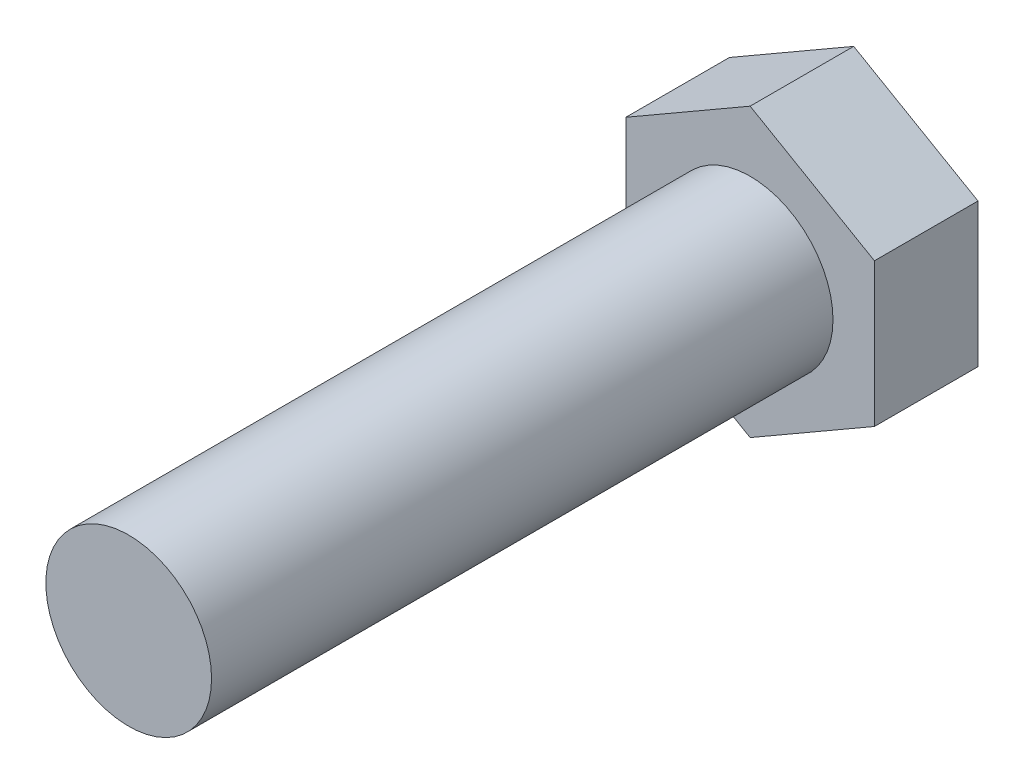
ISO-10303-21;
HEADER;
FILE_DESCRIPTION(('STEP AP214'),'2;1');
FILE_NAME('part.step','',(''),(''),'','','');
FILE_SCHEMA(('AUTOMOTIVE_DESIGN { 1 0 10303 214 1 1 1 1 }'));
ENDSEC;
DATA;
#1=APPLICATION_CONTEXT('core data for automotive mechanical design processes');
#2=APPLICATION_PROTOCOL_DEFINITION('international standard','automotive_design',2000,#1);
#3=PRODUCT_CONTEXT('',#1,'mechanical');
#4=PRODUCT('Part','Part','',(#3));
#5=PRODUCT_RELATED_PRODUCT_CATEGORY('part','',(#4));
#6=PRODUCT_DEFINITION_FORMATION('','',#4);
#7=PRODUCT_DEFINITION_CONTEXT('part definition',#1,'design');
#8=PRODUCT_DEFINITION('design','',#6,#7);
#9=PRODUCT_DEFINITION_SHAPE('','',#8);
#10=(LENGTH_UNIT() NAMED_UNIT(*) SI_UNIT(.MILLI.,.METRE.));
#11=(NAMED_UNIT(*) PLANE_ANGLE_UNIT() SI_UNIT($,.RADIAN.));
#12=(NAMED_UNIT(*) SI_UNIT($,.STERADIAN.) SOLID_ANGLE_UNIT());
#13=UNCERTAINTY_MEASURE_WITH_UNIT(LENGTH_MEASURE(1.E-05),#10,'distance_accuracy_value','');
#14=(GEOMETRIC_REPRESENTATION_CONTEXT(3) GLOBAL_UNCERTAINTY_ASSIGNED_CONTEXT((#13)) GLOBAL_UNIT_ASSIGNED_CONTEXT((#10,
#11,#12)) REPRESENTATION_CONTEXT('',''));
#15=CARTESIAN_POINT('',(0.,0.,0.));
#16=DIRECTION('',(0.,0.,1.));
#17=DIRECTION('',(1.,0.,0.));
#18=AXIS2_PLACEMENT_3D('',#15,#16,#17);
#19=CARTESIAN_POINT('',(6.,3.46410161513776,5.));
#20=DIRECTION('',(-0.5,-0.866025403784439,0.));
#21=DIRECTION('',(0.866025403784439,-0.5,0.));
#22=AXIS2_PLACEMENT_3D('',#19,#20,#21);
#23=PLANE('',#22);
#24=DIRECTION('',(-0.866025403784439,0.5,0.));
#25=VECTOR('',#24,1.);
#26=CARTESIAN_POINT('',(6.,3.46410161513776,0.));
#27=LINE('',#26,#25);
#28=CARTESIAN_POINT('',(6.,3.46410161513776,0.));
#29=VERTEX_POINT('',#28);
#30=CARTESIAN_POINT('',(0.,6.92820323027551,0.));
#31=VERTEX_POINT('',#30);
#32=EDGE_CURVE('E136',#29,#31,#27,.T.);
#33=ORIENTED_EDGE('',*,*,#32,.T.);
#34=DIRECTION('',(0.,0.,-1.));
#35=VECTOR('',#34,1.);
#36=CARTESIAN_POINT('',(0.,6.92820323027551,5.));
#37=LINE('',#36,#35);
#38=CARTESIAN_POINT('',(0.,6.92820323027551,5.));
#39=VERTEX_POINT('',#38);
#40=EDGE_CURVE('E48',#39,#31,#37,.T.);
#41=ORIENTED_EDGE('',*,*,#40,.F.);
#42=DIRECTION('',(-0.866025403784439,0.5,0.));
#43=VECTOR('',#42,1.);
#44=CARTESIAN_POINT('',(6.,3.46410161513776,5.));
#45=LINE('',#44,#43);
#46=CARTESIAN_POINT('',(6.,3.46410161513776,5.));
#47=VERTEX_POINT('',#46);
#48=EDGE_CURVE('E153',#47,#39,#45,.T.);
#49=ORIENTED_EDGE('',*,*,#48,.F.);
#50=DIRECTION('',(0.,0.,-1.));
#51=VECTOR('',#50,1.);
#52=CARTESIAN_POINT('',(6.,3.46410161513776,5.));
#53=LINE('',#52,#51);
#54=EDGE_CURVE('E132',#47,#29,#53,.T.);
#55=ORIENTED_EDGE('',*,*,#54,.T.);
#56=EDGE_LOOP('',(#33,#41,#49,#55));
#57=FACE_BOUND('',#56,.T.);
#58=ADVANCED_FACE('F45',(#57),#23,.F.);
#59=CARTESIAN_POINT('',(0.,6.92820323027551,5.));
#60=DIRECTION('',(0.5,-0.866025403784439,0.));
#61=DIRECTION('',(0.866025403784439,0.5,0.));
#62=AXIS2_PLACEMENT_3D('',#59,#60,#61);
#63=PLANE('',#62);
#64=DIRECTION('',(-0.866025403784439,-0.5,0.));
#65=VECTOR('',#64,1.);
#66=CARTESIAN_POINT('',(0.,6.92820323027551,0.));
#67=LINE('',#66,#65);
#68=CARTESIAN_POINT('',(-6.,3.46410161513776,0.));
#69=VERTEX_POINT('',#68);
#70=EDGE_CURVE('E140',#31,#69,#67,.T.);
#71=ORIENTED_EDGE('',*,*,#70,.T.);
#72=DIRECTION('',(0.,0.,-1.));
#73=VECTOR('',#72,1.);
#74=CARTESIAN_POINT('',(-6.,3.46410161513776,5.));
#75=LINE('',#74,#73);
#76=CARTESIAN_POINT('',(-6.,3.46410161513776,5.));
#77=VERTEX_POINT('',#76);
#78=EDGE_CURVE('E159',#77,#69,#75,.T.);
#79=ORIENTED_EDGE('',*,*,#78,.F.);
#80=DIRECTION('',(-0.866025403784439,-0.5,0.));
#81=VECTOR('',#80,1.);
#82=CARTESIAN_POINT('',(0.,6.92820323027551,5.));
#83=LINE('',#82,#81);
#84=EDGE_CURVE('E101',#39,#77,#83,.T.);
#85=ORIENTED_EDGE('',*,*,#84,.F.);
#86=ORIENTED_EDGE('',*,*,#40,.T.);
#87=EDGE_LOOP('',(#71,#79,#85,#86));
#88=FACE_BOUND('',#87,.T.);
#89=ADVANCED_FACE('F166',(#88),#63,.F.);
#90=CARTESIAN_POINT('',(-6.,3.46410161513776,5.));
#91=DIRECTION('',(1.,0.,0.));
#92=DIRECTION('',(0.,0.,-1.));
#93=AXIS2_PLACEMENT_3D('',#90,#91,#92);
#94=PLANE('',#93);
#95=DIRECTION('',(0.,-1.,0.));
#96=VECTOR('',#95,1.);
#97=CARTESIAN_POINT('',(-6.,3.46410161513776,0.));
#98=LINE('',#97,#96);
#99=CARTESIAN_POINT('',(-6.,-3.46410161513775,0.));
#100=VERTEX_POINT('',#99);
#101=EDGE_CURVE('E144',#69,#100,#98,.T.);
#102=ORIENTED_EDGE('',*,*,#101,.T.);
#103=DIRECTION('',(0.,0.,-1.));
#104=VECTOR('',#103,1.);
#105=CARTESIAN_POINT('',(-6.,-3.46410161513775,5.));
#106=LINE('',#105,#104);
#107=CARTESIAN_POINT('',(-6.,-3.46410161513775,5.));
#108=VERTEX_POINT('',#107);
#109=EDGE_CURVE('E125',#108,#100,#106,.T.);
#110=ORIENTED_EDGE('',*,*,#109,.F.);
#111=DIRECTION('',(0.,-1.,0.));
#112=VECTOR('',#111,1.);
#113=CARTESIAN_POINT('',(-6.,3.46410161513776,5.));
#114=LINE('',#113,#112);
#115=EDGE_CURVE('E114',#77,#108,#114,.T.);
#116=ORIENTED_EDGE('',*,*,#115,.F.);
#117=ORIENTED_EDGE('',*,*,#78,.T.);
#118=EDGE_LOOP('',(#102,#110,#116,#117));
#119=FACE_BOUND('',#118,.T.);
#120=ADVANCED_FACE('F172',(#119),#94,.F.);
#121=CARTESIAN_POINT('',(-6.,-3.46410161513775,5.));
#122=DIRECTION('',(0.5,0.866025403784438,0.));
#123=DIRECTION('',(-0.866025403784439,0.5,0.));
#124=AXIS2_PLACEMENT_3D('',#121,#122,#123);
#125=PLANE('',#124);
#126=DIRECTION('',(0.866025403784438,-0.5,0.));
#127=VECTOR('',#126,1.);
#128=CARTESIAN_POINT('',(-6.,-3.46410161513775,0.));
#129=LINE('',#128,#127);
#130=CARTESIAN_POINT('',(0.,-6.92820323027551,0.));
#131=VERTEX_POINT('',#130);
#132=EDGE_CURVE('E123',#100,#131,#129,.T.);
#133=ORIENTED_EDGE('',*,*,#132,.T.);
#134=DIRECTION('',(0.,0.,-1.));
#135=VECTOR('',#134,1.);
#136=CARTESIAN_POINT('',(0.,-6.92820323027551,5.));
#137=LINE('',#136,#135);
#138=CARTESIAN_POINT('',(0.,-6.92820323027551,5.));
#139=VERTEX_POINT('',#138);
#140=EDGE_CURVE('E120',#139,#131,#137,.T.);
#141=ORIENTED_EDGE('',*,*,#140,.F.);
#142=DIRECTION('',(0.866025403784438,-0.5,0.));
#143=VECTOR('',#142,1.);
#144=CARTESIAN_POINT('',(-6.,-3.46410161513775,5.));
#145=LINE('',#144,#143);
#146=EDGE_CURVE('E108',#108,#139,#145,.T.);
#147=ORIENTED_EDGE('',*,*,#146,.F.);
#148=ORIENTED_EDGE('',*,*,#109,.T.);
#149=EDGE_LOOP('',(#133,#141,#147,#148));
#150=FACE_BOUND('',#149,.T.);
#151=ADVANCED_FACE('F121',(#150),#125,.F.);
#152=CARTESIAN_POINT('',(0.,-6.92820323027551,5.));
#153=DIRECTION('',(-0.5,0.866025403784439,0.));
#154=DIRECTION('',(-0.866025403784439,-0.5,0.));
#155=AXIS2_PLACEMENT_3D('',#152,#153,#154);
#156=PLANE('',#155);
#157=DIRECTION('',(0.866025403784439,0.5,0.));
#158=VECTOR('',#157,1.);
#159=CARTESIAN_POINT('',(0.,-6.92820323027551,0.));
#160=LINE('',#159,#158);
#161=CARTESIAN_POINT('',(6.,-3.46410161513776,0.));
#162=VERTEX_POINT('',#161);
#163=EDGE_CURVE('E86',#131,#162,#160,.T.);
#164=ORIENTED_EDGE('',*,*,#163,.T.);
#165=DIRECTION('',(0.,0.,-1.));
#166=VECTOR('',#165,1.);
#167=CARTESIAN_POINT('',(6.,-3.46410161513776,5.));
#168=LINE('',#167,#166);
#169=CARTESIAN_POINT('',(6.,-3.46410161513776,5.));
#170=VERTEX_POINT('',#169);
#171=EDGE_CURVE('E126',#170,#162,#168,.T.);
#172=ORIENTED_EDGE('',*,*,#171,.F.);
#173=DIRECTION('',(0.866025403784439,0.5,0.));
#174=VECTOR('',#173,1.);
#175=CARTESIAN_POINT('',(0.,-6.92820323027551,5.));
#176=LINE('',#175,#174);
#177=EDGE_CURVE('E112',#139,#170,#176,.T.);
#178=ORIENTED_EDGE('',*,*,#177,.F.);
#179=ORIENTED_EDGE('',*,*,#140,.T.);
#180=EDGE_LOOP('',(#164,#172,#178,#179));
#181=FACE_BOUND('',#180,.T.);
#182=ADVANCED_FACE('F128',(#181),#156,.F.);
#183=CARTESIAN_POINT('',(6.,-3.46410161513776,5.));
#184=DIRECTION('',(-1.,0.,0.));
#185=DIRECTION('',(0.,-1.,0.));
#186=AXIS2_PLACEMENT_3D('',#183,#184,#185);
#187=PLANE('',#186);
#188=DIRECTION('',(0.,1.,0.));
#189=VECTOR('',#188,1.);
#190=CARTESIAN_POINT('',(6.,-3.46410161513776,0.));
#191=LINE('',#190,#189);
#192=EDGE_CURVE('E92',#162,#29,#191,.T.);
#193=ORIENTED_EDGE('',*,*,#192,.T.);
#194=ORIENTED_EDGE('',*,*,#54,.F.);
#195=DIRECTION('',(0.,1.,0.));
#196=VECTOR('',#195,1.);
#197=CARTESIAN_POINT('',(6.,-3.46410161513776,5.));
#198=LINE('',#197,#196);
#199=EDGE_CURVE('E63',#170,#47,#198,.T.);
#200=ORIENTED_EDGE('',*,*,#199,.F.);
#201=ORIENTED_EDGE('',*,*,#171,.T.);
#202=EDGE_LOOP('',(#193,#194,#200,#201));
#203=FACE_BOUND('',#202,.T.);
#204=ADVANCED_FACE('F192',(#203),#187,.F.);
#205=CARTESIAN_POINT('',(0.,0.,5.));
#206=DIRECTION('',(0.,0.,1.));
#207=DIRECTION('',(1.,0.,0.));
#208=AXIS2_PLACEMENT_3D('',#205,#206,#207);
#209=PLANE('',#208);
#210=CARTESIAN_POINT('',(0.,0.,5.));
#211=DIRECTION('',(0.,0.,1.));
#212=DIRECTION('',(1.,0.,0.));
#213=AXIS2_PLACEMENT_3D('',#210,#211,#212);
#214=CIRCLE('',#213,4.);
#215=CARTESIAN_POINT('',(4.,0.,5.));
#216=VERTEX_POINT('',#215);
#217=EDGE_CURVE('E11',#216,#216,#214,.T.);
#218=ORIENTED_EDGE('',*,*,#217,.F.);
#219=EDGE_LOOP('',(#218));
#220=FACE_BOUND('',#219,.T.);
#221=ORIENTED_EDGE('',*,*,#48,.T.);
#222=ORIENTED_EDGE('',*,*,#84,.T.);
#223=ORIENTED_EDGE('',*,*,#115,.T.);
#224=ORIENTED_EDGE('',*,*,#146,.T.);
#225=ORIENTED_EDGE('',*,*,#177,.T.);
#226=ORIENTED_EDGE('',*,*,#199,.T.);
#227=EDGE_LOOP('',(#221,#222,#223,#224,#225,#226));
#228=FACE_BOUND('',#227,.T.);
#229=ADVANCED_FACE('F110',(#220,#228),#209,.T.);
#230=CARTESIAN_POINT('',(0.,0.,0.));
#231=DIRECTION('',(0.,0.,1.));
#232=DIRECTION('',(1.,0.,0.));
#233=AXIS2_PLACEMENT_3D('',#230,#231,#232);
#234=PLANE('',#233);
#235=ORIENTED_EDGE('',*,*,#32,.F.);
#236=ORIENTED_EDGE('',*,*,#192,.F.);
#237=ORIENTED_EDGE('',*,*,#163,.F.);
#238=ORIENTED_EDGE('',*,*,#132,.F.);
#239=ORIENTED_EDGE('',*,*,#101,.F.);
#240=ORIENTED_EDGE('',*,*,#70,.F.);
#241=EDGE_LOOP('',(#235,#236,#237,#238,#239,#240));
#242=FACE_BOUND('',#241,.T.);
#243=ADVANCED_FACE('F171',(#242),#234,.F.);
#244=CARTESIAN_POINT('',(0.,0.,35.));
#245=DIRECTION('',(0.,0.,-1.));
#246=DIRECTION('',(-1.,0.,0.));
#247=AXIS2_PLACEMENT_3D('',#244,#245,#246);
#248=CYLINDRICAL_SURFACE('',#247,4.);
#249=CARTESIAN_POINT('',(0.,0.,35.));
#250=DIRECTION('',(0.,0.,1.));
#251=DIRECTION('',(1.,0.,0.));
#252=AXIS2_PLACEMENT_3D('',#249,#250,#251);
#253=CIRCLE('',#252,4.);
#254=CARTESIAN_POINT('',(4.,0.,35.));
#255=VERTEX_POINT('',#254);
#256=EDGE_CURVE('E141',#255,#255,#253,.T.);
#257=ORIENTED_EDGE('',*,*,#256,.F.);
#258=EDGE_LOOP('',(#257));
#259=FACE_BOUND('',#258,.T.);
#260=ORIENTED_EDGE('',*,*,#217,.T.);
#261=EDGE_LOOP('',(#260));
#262=FACE_BOUND('',#261,.T.);
#263=ADVANCED_FACE('F185',(#259,#262),#248,.T.);
#264=CARTESIAN_POINT('',(0.,0.,35.));
#265=DIRECTION('',(0.,0.,1.));
#266=DIRECTION('',(1.,0.,0.));
#267=AXIS2_PLACEMENT_3D('',#264,#265,#266);
#268=PLANE('',#267);
#269=ORIENTED_EDGE('',*,*,#256,.T.);
#270=EDGE_LOOP('',(#269));
#271=FACE_BOUND('',#270,.T.);
#272=ADVANCED_FACE('F183',(#271),#268,.T.);
#273=CLOSED_SHELL('',(#58,#89,#120,#151,#182,#204,#229,#243,#263,#272));
#274=MANIFOLD_SOLID_BREP('B2',#273);
#275=ADVANCED_BREP_SHAPE_REPRESENTATION('',(#18,#274),#14);
#276=SHAPE_DEFINITION_REPRESENTATION(#9,#275);
ENDSEC;
END-ISO-10303-21;
